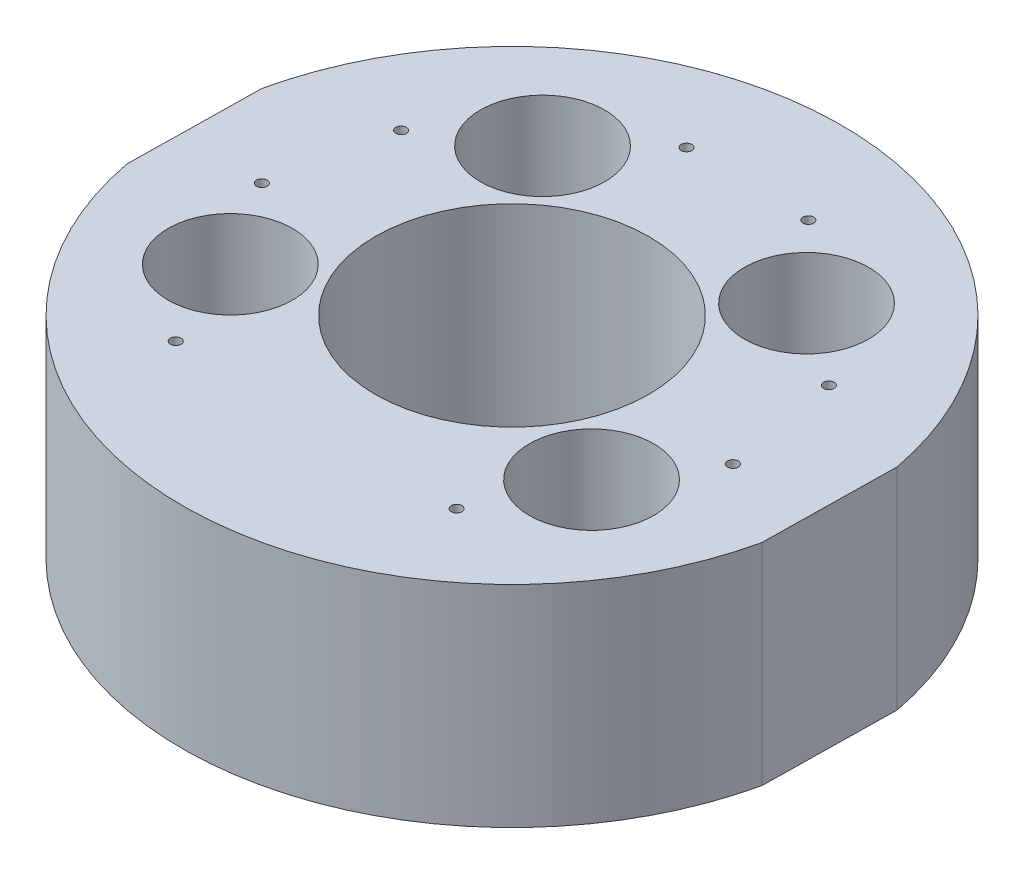
ISO-10303-21;
HEADER;
FILE_DESCRIPTION(('STEP AP214'),'2;1');
FILE_NAME('part.step','',(''),(''),'','','');
FILE_SCHEMA(('AUTOMOTIVE_DESIGN { 1 0 10303 214 1 1 1 1 }'));
ENDSEC;
DATA;
#1=APPLICATION_CONTEXT('core data for automotive mechanical design processes');
#2=APPLICATION_PROTOCOL_DEFINITION('international standard','automotive_design',2000,#1);
#3=PRODUCT_CONTEXT('',#1,'mechanical');
#4=PRODUCT('Part','Part','',(#3));
#5=PRODUCT_RELATED_PRODUCT_CATEGORY('part','',(#4));
#6=PRODUCT_DEFINITION_FORMATION('','',#4);
#7=PRODUCT_DEFINITION_CONTEXT('part definition',#1,'design');
#8=PRODUCT_DEFINITION('design','',#6,#7);
#9=PRODUCT_DEFINITION_SHAPE('','',#8);
#10=(LENGTH_UNIT() NAMED_UNIT(*) SI_UNIT(.MILLI.,.METRE.));
#11=(NAMED_UNIT(*) PLANE_ANGLE_UNIT() SI_UNIT($,.RADIAN.));
#12=(NAMED_UNIT(*) SI_UNIT($,.STERADIAN.) SOLID_ANGLE_UNIT());
#13=UNCERTAINTY_MEASURE_WITH_UNIT(LENGTH_MEASURE(1.E-05),#10,'distance_accuracy_value','');
#14=(GEOMETRIC_REPRESENTATION_CONTEXT(3) GLOBAL_UNCERTAINTY_ASSIGNED_CONTEXT((#13)) GLOBAL_UNIT_ASSIGNED_CONTEXT((#10,
#11,#12)) REPRESENTATION_CONTEXT('',''));
#15=CARTESIAN_POINT('',(0.,0.,0.));
#16=DIRECTION('',(0.,0.,1.));
#17=DIRECTION('',(1.,0.,0.));
#18=AXIS2_PLACEMENT_3D('',#15,#16,#17);
#19=CARTESIAN_POINT('',(-1.02943253800123,39.5,1.15205181792758));
#20=DIRECTION('',(0.,1.,0.));
#21=DIRECTION('',(0.,0.,1.));
#22=AXIS2_PLACEMENT_3D('',#19,#20,#21);
#23=PLANE('',#22);
#24=CARTESIAN_POINT('',(-41.5047424392578,39.5,-18.5138905291484));
#25=DIRECTION('',(0.,1.,0.));
#26=DIRECTION('',(0.,0.,1.));
#27=AXIS2_PLACEMENT_3D('',#24,#25,#26);
#28=CIRCLE('',#27,0.999999999999998);
#29=CARTESIAN_POINT('',(-41.5047424392578,39.5,-17.5138905291484));
#30=VERTEX_POINT('',#29);
#31=EDGE_CURVE('E41',#30,#30,#28,.T.);
#32=ORIENTED_EDGE('',*,*,#31,.F.);
#33=EDGE_LOOP('',(#32));
#34=FACE_BOUND('',#33,.T.);
#35=CARTESIAN_POINT('',(-45.985781079176,39.5,3.13364860960269));
#36=DIRECTION('',(0.,1.,0.));
#37=DIRECTION('',(0.,0.,1.));
#38=AXIS2_PLACEMENT_3D('',#35,#36,#37);
#39=CIRCLE('',#38,0.999999999999999);
#40=CARTESIAN_POINT('',(-45.985781079176,39.5,4.13364860960269));
#41=VERTEX_POINT('',#40);
#42=EDGE_CURVE('E137',#41,#41,#39,.T.);
#43=ORIENTED_EDGE('',*,*,#42,.F.);
#44=EDGE_LOOP('',(#43));
#45=FACE_BOUND('',#44,.T.);
#46=CARTESIAN_POINT('',(-28.3813979746461,39.5,36.8853694186284));
#47=DIRECTION('',(0.,1.,0.));
#48=DIRECTION('',(0.,0.,1.));
#49=AXIS2_PLACEMENT_3D('',#46,#47,#48);
#50=CIRCLE('',#49,1.);
#51=CARTESIAN_POINT('',(-28.3813979746461,39.5,37.8853694186284));
#52=VERTEX_POINT('',#51);
#53=EDGE_CURVE('E134',#52,#52,#50,.T.);
#54=ORIENTED_EDGE('',*,*,#53,.F.);
#55=EDGE_LOOP('',(#54));
#56=FACE_BOUND('',#55,.T.);
#57=CARTESIAN_POINT('',(25.1688006416338,39.5,37.7396532460756));
#58=DIRECTION('',(0.,1.,0.));
#59=DIRECTION('',(0.,0.,1.));
#60=AXIS2_PLACEMENT_3D('',#57,#58,#59);
#61=CIRCLE('',#60,1.);
#62=CARTESIAN_POINT('',(25.1688006416338,39.5,38.7396532460756));
#63=VERTEX_POINT('',#62);
#64=EDGE_CURVE('E130',#63,#63,#61,.T.);
#65=ORIENTED_EDGE('',*,*,#64,.F.);
#66=EDGE_LOOP('',(#65));
#67=FACE_BOUND('',#66,.T.);
#68=CARTESIAN_POINT('',(43.8408307817754,39.5,4.56664837001532));
#69=DIRECTION('',(0.,1.,0.));
#70=DIRECTION('',(0.,0.,1.));
#71=AXIS2_PLACEMENT_3D('',#68,#69,#70);
#72=CIRCLE('',#71,0.999999999999999);
#73=CARTESIAN_POINT('',(43.8408307817754,39.5,5.56664837001532));
#74=VERTEX_POINT('',#73);
#75=EDGE_CURVE('E126',#74,#74,#72,.T.);
#76=ORIENTED_EDGE('',*,*,#75,.F.);
#77=EDGE_LOOP('',(#76));
#78=FACE_BOUND('',#77,.T.);
#79=CARTESIAN_POINT('',(40.0525810184068,39.5,-17.2128103419404));
#80=DIRECTION('',(0.,1.,0.));
#81=DIRECTION('',(0.,0.,1.));
#82=AXIS2_PLACEMENT_3D('',#79,#80,#81);
#83=CIRCLE('',#82,1.);
#84=CARTESIAN_POINT('',(40.0525810184068,39.5,-16.2128103419404));
#85=VERTEX_POINT('',#84);
#86=EDGE_CURVE('E122',#85,#85,#83,.T.);
#87=ORIENTED_EDGE('',*,*,#86,.F.);
#88=EDGE_LOOP('',(#87));
#89=FACE_BOUND('',#88,.T.);
#90=CARTESIAN_POINT('',(11.2760466756778,39.5,-42.1327628556033));
#91=DIRECTION('',(0.,1.,0.));
#92=DIRECTION('',(0.,0.,1.));
#93=AXIS2_PLACEMENT_3D('',#90,#91,#92);
#94=CIRCLE('',#93,1.);
#95=CARTESIAN_POINT('',(11.2760466756778,39.5,-41.1327628556033));
#96=VERTEX_POINT('',#95);
#97=EDGE_CURVE('E118',#96,#96,#94,.T.);
#98=ORIENTED_EDGE('',*,*,#97,.F.);
#99=EDGE_LOOP('',(#98));
#100=FACE_BOUND('',#99,.T.);
#101=CARTESIAN_POINT('',(-11.9479600481531,39.5,-42.5032543545264));
#102=DIRECTION('',(0.,1.,0.));
#103=DIRECTION('',(0.,0.,1.));
#104=AXIS2_PLACEMENT_3D('',#101,#102,#103);
#105=CIRCLE('',#104,1.);
#106=CARTESIAN_POINT('',(-11.9479600481531,39.5,-41.5032543545264));
#107=VERTEX_POINT('',#106);
#108=EDGE_CURVE('E113',#107,#107,#105,.T.);
#109=ORIENTED_EDGE('',*,*,#108,.F.);
#110=EDGE_LOOP('',(#109));
#111=FACE_BOUND('',#110,.T.);
#112=CARTESIAN_POINT('',(33.1065521303134,39.5,20.3661126777402));
#113=DIRECTION('',(0.,1.,0.));
#114=DIRECTION('',(0.,0.,1.));
#115=AXIS2_PLACEMENT_3D('',#112,#113,#114);
#116=CIRCLE('',#115,11.666);
#117=CARTESIAN_POINT('',(33.1065521303134,39.5,32.0321126777402));
#118=VERTEX_POINT('',#117);
#119=EDGE_CURVE('E168',#118,#118,#116,.T.);
#120=ORIENTED_EDGE('',*,*,#119,.F.);
#121=EDGE_LOOP('',(#120));
#122=FACE_BOUND('',#121,.T.);
#123=CARTESIAN_POINT('',(-25.7151840641316,39.5,-29.2627349738644));
#124=DIRECTION('',(0.,1.,0.));
#125=DIRECTION('',(0.,0.,1.));
#126=AXIS2_PLACEMENT_3D('',#123,#124,#125);
#127=CIRCLE('',#126,11.666);
#128=CARTESIAN_POINT('',(-25.7151840641316,39.5,-17.5967349738644));
#129=VERTEX_POINT('',#128);
#130=EDGE_CURVE('E180',#129,#129,#127,.T.);
#131=ORIENTED_EDGE('',*,*,#130,.F.);
#132=EDGE_LOOP('',(#131));
#133=FACE_BOUND('',#132,.T.);
#134=CARTESIAN_POINT('',(-1.02943253800123,39.5,1.15205181792758));
#135=DIRECTION('',(0.,1.,0.));
#136=DIRECTION('',(0.,0.,1.));
#137=AXIS2_PLACEMENT_3D('',#134,#135,#136);
#138=CIRCLE('',#137,61.8170061942189);
#139=CARTESIAN_POINT('',(59.7022572722056,39.5,-10.3806888629692));
#140=VERTEX_POINT('',#139);
#141=CARTESIAN_POINT('',(-61.3623492511472,39.5,-12.3120268991914));
#142=VERTEX_POINT('',#141);
#143=EDGE_CURVE('E91',#140,#142,#138,.T.);
#144=ORIENTED_EDGE('',*,*,#143,.T.);
#145=DIRECTION('',(-0.0159509238824959,0.,0.999872775920664));
#146=VECTOR('',#145,1.);
#147=CARTESIAN_POINT('',(-61.3623492511472,39.5,-12.3120268991914));
#148=LINE('',#147,#146);
#149=CARTESIAN_POINT('',(-61.7611223482096,39.5,12.6847924988252));
#150=VERTEX_POINT('',#149);
#151=EDGE_CURVE('E86',#142,#150,#148,.T.);
#152=ORIENTED_EDGE('',*,*,#151,.T.);
#153=CARTESIAN_POINT('',(-1.02943253800123,39.5,1.15205181792758));
#154=DIRECTION('',(0.,1.,0.));
#155=DIRECTION('',(0.,0.,1.));
#156=AXIS2_PLACEMENT_3D('',#153,#154,#155);
#157=CIRCLE('',#156,61.817006194219);
#158=CARTESIAN_POINT('',(59.303484175144,39.5,14.6161305350469));
#159=VERTEX_POINT('',#158);
#160=EDGE_CURVE('E89',#150,#159,#157,.T.);
#161=ORIENTED_EDGE('',*,*,#160,.T.);
#162=DIRECTION('',(0.0159509238824956,0.,-0.999872775920664));
#163=VECTOR('',#162,1.);
#164=CARTESIAN_POINT('',(59.7022572722056,39.5,-10.3806888629692));
#165=LINE('',#164,#163);
#166=EDGE_CURVE('E56',#159,#140,#165,.T.);
#167=ORIENTED_EDGE('',*,*,#166,.T.);
#168=EDGE_LOOP('',(#144,#152,#161,#167));
#169=FACE_BOUND('',#168,.T.);
#170=CARTESIAN_POINT('',(-1.02943253800123,39.5,1.15205181792758));
#171=DIRECTION('',(0.,1.,0.));
#172=DIRECTION('',(0.,0.,1.));
#173=AXIS2_PLACEMENT_3D('',#170,#171,#172);
#174=CIRCLE('',#173,25.6670000000009);
#175=CARTESIAN_POINT('',(-1.02943253800123,39.5,26.8190518179285));
#176=VERTEX_POINT('',#175);
#177=EDGE_CURVE('E107',#176,#176,#174,.T.);
#178=ORIENTED_EDGE('',*,*,#177,.F.);
#179=EDGE_LOOP('',(#178));
#180=FACE_BOUND('',#179,.T.);
#181=CARTESIAN_POINT('',(24.6139217532643,39.5,-28.4598370899525));
#182=DIRECTION('',(0.,1.,0.));
#183=DIRECTION('',(0.,0.,1.));
#184=AXIS2_PLACEMENT_3D('',#181,#182,#183);
#185=CIRCLE('',#184,11.666);
#186=CARTESIAN_POINT('',(24.6139217532643,39.5,-16.7938370899525));
#187=VERTEX_POINT('',#186);
#188=EDGE_CURVE('E174',#187,#187,#185,.T.);
#189=ORIENTED_EDGE('',*,*,#188,.F.);
#190=EDGE_LOOP('',(#189));
#191=FACE_BOUND('',#190,.T.);
#192=CARTESIAN_POINT('',(-35.7609326951884,39.5,19.2674728958744));
#193=DIRECTION('',(0.,1.,0.));
#194=DIRECTION('',(0.,0.,1.));
#195=AXIS2_PLACEMENT_3D('',#192,#193,#194);
#196=CIRCLE('',#195,11.666);
#197=CARTESIAN_POINT('',(-35.7609326951884,39.5,30.9334728958744));
#198=VERTEX_POINT('',#197);
#199=EDGE_CURVE('E162',#198,#198,#196,.T.);
#200=ORIENTED_EDGE('',*,*,#199,.F.);
#201=EDGE_LOOP('',(#200));
#202=FACE_BOUND('',#201,.T.);
#203=ADVANCED_FACE('F37',(#34,#45,#56,#67,#78,#89,#100,#111,#122,#133,#169,#180,#191,#202),#23,.T.);
#204=CARTESIAN_POINT('',(-1.02943253800123,0.,1.15205181792758));
#205=DIRECTION('',(0.,1.,0.));
#206=DIRECTION('',(0.,0.,1.));
#207=AXIS2_PLACEMENT_3D('',#204,#205,#206);
#208=PLANE('',#207);
#209=CARTESIAN_POINT('',(33.1065521303134,0.,20.3661126777402));
#210=DIRECTION('',(0.,1.,0.));
#211=DIRECTION('',(0.,0.,1.));
#212=AXIS2_PLACEMENT_3D('',#209,#210,#211);
#213=CIRCLE('',#212,11.666);
#214=CARTESIAN_POINT('',(33.1065521303134,0.,32.0321126777402));
#215=VERTEX_POINT('',#214);
#216=EDGE_CURVE('E165',#215,#215,#213,.T.);
#217=ORIENTED_EDGE('',*,*,#216,.T.);
#218=EDGE_LOOP('',(#217));
#219=FACE_BOUND('',#218,.T.);
#220=CARTESIAN_POINT('',(-25.7151840641316,0.,-29.2627349738644));
#221=DIRECTION('',(0.,1.,0.));
#222=DIRECTION('',(0.,0.,1.));
#223=AXIS2_PLACEMENT_3D('',#220,#221,#222);
#224=CIRCLE('',#223,11.666);
#225=CARTESIAN_POINT('',(-25.7151840641316,0.,-17.5967349738644));
#226=VERTEX_POINT('',#225);
#227=EDGE_CURVE('E177',#226,#226,#224,.T.);
#228=ORIENTED_EDGE('',*,*,#227,.T.);
#229=EDGE_LOOP('',(#228));
#230=FACE_BOUND('',#229,.T.);
#231=CARTESIAN_POINT('',(-1.02943253800123,0.,1.15205181792758));
#232=DIRECTION('',(0.,1.,0.));
#233=DIRECTION('',(0.,0.,1.));
#234=AXIS2_PLACEMENT_3D('',#231,#232,#233);
#235=CIRCLE('',#234,61.8170061942189);
#236=CARTESIAN_POINT('',(59.7022572722056,0.,-10.3806888629692));
#237=VERTEX_POINT('',#236);
#238=CARTESIAN_POINT('',(-61.3623492511472,0.,-12.3120268991914));
#239=VERTEX_POINT('',#238);
#240=EDGE_CURVE('E104',#237,#239,#235,.T.);
#241=ORIENTED_EDGE('',*,*,#240,.F.);
#242=DIRECTION('',(0.0159509238824956,0.,-0.999872775920664));
#243=VECTOR('',#242,1.);
#244=CARTESIAN_POINT('',(59.7022572722056,0.,-10.3806888629692));
#245=LINE('',#244,#243);
#246=CARTESIAN_POINT('',(59.303484175144,0.,14.6161305350469));
#247=VERTEX_POINT('',#246);
#248=EDGE_CURVE('E79',#247,#237,#245,.T.);
#249=ORIENTED_EDGE('',*,*,#248,.F.);
#250=CARTESIAN_POINT('',(-1.02943253800123,0.,1.15205181792758));
#251=DIRECTION('',(0.,1.,0.));
#252=DIRECTION('',(0.,0.,1.));
#253=AXIS2_PLACEMENT_3D('',#250,#251,#252);
#254=CIRCLE('',#253,61.817006194219);
#255=CARTESIAN_POINT('',(-61.7611223482096,0.,12.6847924988252));
#256=VERTEX_POINT('',#255);
#257=EDGE_CURVE('E73',#256,#247,#254,.T.);
#258=ORIENTED_EDGE('',*,*,#257,.F.);
#259=DIRECTION('',(-0.0159509238824959,0.,0.999872775920664));
#260=VECTOR('',#259,1.);
#261=CARTESIAN_POINT('',(-61.3623492511472,0.,-12.3120268991914));
#262=LINE('',#261,#260);
#263=EDGE_CURVE('E95',#239,#256,#262,.T.);
#264=ORIENTED_EDGE('',*,*,#263,.F.);
#265=EDGE_LOOP('',(#241,#249,#258,#264));
#266=FACE_BOUND('',#265,.T.);
#267=CARTESIAN_POINT('',(-1.02943253800123,0.,1.15205181792758));
#268=DIRECTION('',(0.,1.,0.));
#269=DIRECTION('',(0.,0.,1.));
#270=AXIS2_PLACEMENT_3D('',#267,#268,#269);
#271=CIRCLE('',#270,25.6670000000009);
#272=CARTESIAN_POINT('',(-1.02943253800123,0.,26.8190518179285));
#273=VERTEX_POINT('',#272);
#274=EDGE_CURVE('E183',#273,#273,#271,.T.);
#275=ORIENTED_EDGE('',*,*,#274,.T.);
#276=EDGE_LOOP('',(#275));
#277=FACE_BOUND('',#276,.T.);
#278=CARTESIAN_POINT('',(24.6139217532643,0.,-28.4598370899525));
#279=DIRECTION('',(0.,1.,0.));
#280=DIRECTION('',(0.,0.,1.));
#281=AXIS2_PLACEMENT_3D('',#278,#279,#280);
#282=CIRCLE('',#281,11.666);
#283=CARTESIAN_POINT('',(24.6139217532643,0.,-16.7938370899525));
#284=VERTEX_POINT('',#283);
#285=EDGE_CURVE('E171',#284,#284,#282,.T.);
#286=ORIENTED_EDGE('',*,*,#285,.T.);
#287=EDGE_LOOP('',(#286));
#288=FACE_BOUND('',#287,.T.);
#289=CARTESIAN_POINT('',(-35.7609326951884,0.,19.2674728958744));
#290=DIRECTION('',(0.,1.,0.));
#291=DIRECTION('',(0.,0.,1.));
#292=AXIS2_PLACEMENT_3D('',#289,#290,#291);
#293=CIRCLE('',#292,11.666);
#294=CARTESIAN_POINT('',(-35.7609326951884,0.,30.9334728958744));
#295=VERTEX_POINT('',#294);
#296=EDGE_CURVE('E116',#295,#295,#293,.T.);
#297=ORIENTED_EDGE('',*,*,#296,.T.);
#298=EDGE_LOOP('',(#297));
#299=FACE_BOUND('',#298,.T.);
#300=ADVANCED_FACE('F191',(#219,#230,#266,#277,#288,#299),#208,.F.);
#301=CARTESIAN_POINT('',(-1.02943253800123,39.5,1.15205181792758));
#302=DIRECTION('',(0.,-1.,0.));
#303=DIRECTION('',(0.,0.,-1.));
#304=AXIS2_PLACEMENT_3D('',#301,#302,#303);
#305=CYLINDRICAL_SURFACE('',#304,61.8170061942189);
#306=ORIENTED_EDGE('',*,*,#240,.T.);
#307=DIRECTION('',(0.,-1.,0.));
#308=VECTOR('',#307,1.);
#309=CARTESIAN_POINT('',(-61.3623492511472,39.5,-12.3120268991914));
#310=LINE('',#309,#308);
#311=EDGE_CURVE('E11',#142,#239,#310,.T.);
#312=ORIENTED_EDGE('',*,*,#311,.F.);
#313=ORIENTED_EDGE('',*,*,#143,.F.);
#314=DIRECTION('',(0.,-1.,0.));
#315=VECTOR('',#314,1.);
#316=CARTESIAN_POINT('',(59.7022572722056,39.5,-10.3806888629692));
#317=LINE('',#316,#315);
#318=EDGE_CURVE('E100',#140,#237,#317,.T.);
#319=ORIENTED_EDGE('',*,*,#318,.T.);
#320=EDGE_LOOP('',(#306,#312,#313,#319));
#321=FACE_BOUND('',#320,.T.);
#322=ADVANCED_FACE('F39',(#321),#305,.T.);
#323=CARTESIAN_POINT('',(-61.3623492511472,39.5,-12.3120268991914));
#324=DIRECTION('',(0.999872775920664,0.,0.0159509238824959));
#325=DIRECTION('',(0.0159509238824959,0.,-0.999872775920664));
#326=AXIS2_PLACEMENT_3D('',#323,#324,#325);
#327=PLANE('',#326);
#328=ORIENTED_EDGE('',*,*,#263,.T.);
#329=DIRECTION('',(0.,-1.,0.));
#330=VECTOR('',#329,1.);
#331=CARTESIAN_POINT('',(-61.7611223482096,39.5,12.6847924988252));
#332=LINE('',#331,#330);
#333=EDGE_CURVE('E47',#150,#256,#332,.T.);
#334=ORIENTED_EDGE('',*,*,#333,.F.);
#335=ORIENTED_EDGE('',*,*,#151,.F.);
#336=ORIENTED_EDGE('',*,*,#311,.T.);
#337=EDGE_LOOP('',(#328,#334,#335,#336));
#338=FACE_BOUND('',#337,.T.);
#339=ADVANCED_FACE('F94',(#338),#327,.F.);
#340=CARTESIAN_POINT('',(-1.02943253800123,39.5,1.15205181792758));
#341=DIRECTION('',(0.,-1.,0.));
#342=DIRECTION('',(0.,0.,-1.));
#343=AXIS2_PLACEMENT_3D('',#340,#341,#342);
#344=CYLINDRICAL_SURFACE('',#343,61.817006194219);
#345=ORIENTED_EDGE('',*,*,#257,.T.);
#346=DIRECTION('',(0.,-1.,0.));
#347=VECTOR('',#346,1.);
#348=CARTESIAN_POINT('',(59.303484175144,39.5,14.6161305350469));
#349=LINE('',#348,#347);
#350=EDGE_CURVE('E96',#159,#247,#349,.T.);
#351=ORIENTED_EDGE('',*,*,#350,.F.);
#352=ORIENTED_EDGE('',*,*,#160,.F.);
#353=ORIENTED_EDGE('',*,*,#333,.T.);
#354=EDGE_LOOP('',(#345,#351,#352,#353));
#355=FACE_BOUND('',#354,.T.);
#356=ADVANCED_FACE('F98',(#355),#344,.T.);
#357=CARTESIAN_POINT('',(59.7022572722056,39.5,-10.3806888629692));
#358=DIRECTION('',(-0.999872775920664,0.,-0.0159509238824956));
#359=DIRECTION('',(-0.0159509238824956,0.,0.999872775920664));
#360=AXIS2_PLACEMENT_3D('',#357,#358,#359);
#361=PLANE('',#360);
#362=ORIENTED_EDGE('',*,*,#248,.T.);
#363=ORIENTED_EDGE('',*,*,#318,.F.);
#364=ORIENTED_EDGE('',*,*,#166,.F.);
#365=ORIENTED_EDGE('',*,*,#350,.T.);
#366=EDGE_LOOP('',(#362,#363,#364,#365));
#367=FACE_BOUND('',#366,.T.);
#368=ADVANCED_FACE('F197',(#367),#361,.F.);
#369=CARTESIAN_POINT('',(-1.02943253800123,39.5,1.15205181792758));
#370=DIRECTION('',(0.,-1.,0.));
#371=DIRECTION('',(0.,0.,-1.));
#372=AXIS2_PLACEMENT_3D('',#369,#370,#371);
#373=CYLINDRICAL_SURFACE('',#372,25.6670000000009);
#374=ORIENTED_EDGE('',*,*,#177,.T.);
#375=EDGE_LOOP('',(#374));
#376=FACE_BOUND('',#375,.T.);
#377=ORIENTED_EDGE('',*,*,#274,.F.);
#378=EDGE_LOOP('',(#377));
#379=FACE_BOUND('',#378,.T.);
#380=ADVANCED_FACE('F194',(#376,#379),#373,.F.);
#381=CARTESIAN_POINT('',(-25.7151840641316,39.5,-29.2627349738644));
#382=DIRECTION('',(0.,-1.,0.));
#383=DIRECTION('',(0.,0.,-1.));
#384=AXIS2_PLACEMENT_3D('',#381,#382,#383);
#385=CYLINDRICAL_SURFACE('',#384,11.666);
#386=ORIENTED_EDGE('',*,*,#130,.T.);
#387=EDGE_LOOP('',(#386));
#388=FACE_BOUND('',#387,.T.);
#389=ORIENTED_EDGE('',*,*,#227,.F.);
#390=EDGE_LOOP('',(#389));
#391=FACE_BOUND('',#390,.T.);
#392=ADVANCED_FACE('F196',(#388,#391),#385,.F.);
#393=CARTESIAN_POINT('',(24.6139217532643,39.5,-28.4598370899525));
#394=DIRECTION('',(0.,-1.,0.));
#395=DIRECTION('',(0.,0.,-1.));
#396=AXIS2_PLACEMENT_3D('',#393,#394,#395);
#397=CYLINDRICAL_SURFACE('',#396,11.666);
#398=ORIENTED_EDGE('',*,*,#188,.T.);
#399=EDGE_LOOP('',(#398));
#400=FACE_BOUND('',#399,.T.);
#401=ORIENTED_EDGE('',*,*,#285,.F.);
#402=EDGE_LOOP('',(#401));
#403=FACE_BOUND('',#402,.T.);
#404=ADVANCED_FACE('F204',(#400,#403),#397,.F.);
#405=CARTESIAN_POINT('',(33.1065521303134,39.5,20.3661126777402));
#406=DIRECTION('',(0.,-1.,0.));
#407=DIRECTION('',(0.,0.,-1.));
#408=AXIS2_PLACEMENT_3D('',#405,#406,#407);
#409=CYLINDRICAL_SURFACE('',#408,11.666);
#410=ORIENTED_EDGE('',*,*,#119,.T.);
#411=EDGE_LOOP('',(#410));
#412=FACE_BOUND('',#411,.T.);
#413=ORIENTED_EDGE('',*,*,#216,.F.);
#414=EDGE_LOOP('',(#413));
#415=FACE_BOUND('',#414,.T.);
#416=ADVANCED_FACE('F274',(#412,#415),#409,.F.);
#417=CARTESIAN_POINT('',(-35.7609326951884,39.5,19.2674728958744));
#418=DIRECTION('',(0.,-1.,0.));
#419=DIRECTION('',(0.,0.,-1.));
#420=AXIS2_PLACEMENT_3D('',#417,#418,#419);
#421=CYLINDRICAL_SURFACE('',#420,11.666);
#422=ORIENTED_EDGE('',*,*,#199,.T.);
#423=EDGE_LOOP('',(#422));
#424=FACE_BOUND('',#423,.T.);
#425=ORIENTED_EDGE('',*,*,#296,.F.);
#426=EDGE_LOOP('',(#425));
#427=FACE_BOUND('',#426,.T.);
#428=ADVANCED_FACE('F283',(#424,#427),#421,.F.);
#429=CARTESIAN_POINT('',(-11.9479600481531,28.5,-42.5032543545264));
#430=DIRECTION('',(0.,1.,0.));
#431=DIRECTION('',(-1.,0.,0.));
#432=AXIS2_PLACEMENT_3D('',#429,#430,#431);
#433=CYLINDRICAL_SURFACE('',#432,1.);
#434=ORIENTED_EDGE('',*,*,#108,.T.);
#435=EDGE_LOOP('',(#434));
#436=FACE_BOUND('',#435,.T.);
#437=CARTESIAN_POINT('',(-11.9479600481531,28.5,-42.5032543545264));
#438=DIRECTION('',(0.,1.,0.));
#439=DIRECTION('',(-1.,0.,0.));
#440=AXIS2_PLACEMENT_3D('',#437,#438,#439);
#441=CIRCLE('',#440,1.);
#442=CARTESIAN_POINT('',(-12.9479600481531,28.5,-42.5032543545264));
#443=VERTEX_POINT('',#442);
#444=EDGE_CURVE('E117',#443,#443,#441,.T.);
#445=ORIENTED_EDGE('',*,*,#444,.F.);
#446=EDGE_LOOP('',(#445));
#447=FACE_BOUND('',#446,.T.);
#448=ADVANCED_FACE('F291',(#436,#447),#433,.F.);
#449=CARTESIAN_POINT('',(-11.9479600481531,28.5,-42.5032543545264));
#450=DIRECTION('',(0.,1.,0.));
#451=DIRECTION('',(-1.,0.,0.));
#452=AXIS2_PLACEMENT_3D('',#449,#450,#451);
#453=PLANE('',#452);
#454=ORIENTED_EDGE('',*,*,#444,.T.);
#455=EDGE_LOOP('',(#454));
#456=FACE_BOUND('',#455,.T.);
#457=ADVANCED_FACE('F299',(#456),#453,.T.);
#458=CARTESIAN_POINT('',(11.2760466756778,28.5,-42.1327628556033));
#459=DIRECTION('',(0.,1.,0.));
#460=DIRECTION('',(-1.,0.,0.));
#461=AXIS2_PLACEMENT_3D('',#458,#459,#460);
#462=CYLINDRICAL_SURFACE('',#461,1.);
#463=ORIENTED_EDGE('',*,*,#97,.T.);
#464=EDGE_LOOP('',(#463));
#465=FACE_BOUND('',#464,.T.);
#466=CARTESIAN_POINT('',(11.2760466756778,28.5,-42.1327628556033));
#467=DIRECTION('',(0.,1.,0.));
#468=DIRECTION('',(-1.,0.,0.));
#469=AXIS2_PLACEMENT_3D('',#466,#467,#468);
#470=CIRCLE('',#469,1.);
#471=CARTESIAN_POINT('',(10.2760466756778,28.5,-42.1327628556033));
#472=VERTEX_POINT('',#471);
#473=EDGE_CURVE('E121',#472,#472,#470,.T.);
#474=ORIENTED_EDGE('',*,*,#473,.F.);
#475=EDGE_LOOP('',(#474));
#476=FACE_BOUND('',#475,.T.);
#477=ADVANCED_FACE('F308',(#465,#476),#462,.F.);
#478=CARTESIAN_POINT('',(11.2760466756778,28.5,-42.1327628556033));
#479=DIRECTION('',(0.,1.,0.));
#480=DIRECTION('',(-1.,0.,0.));
#481=AXIS2_PLACEMENT_3D('',#478,#479,#480);
#482=PLANE('',#481);
#483=ORIENTED_EDGE('',*,*,#473,.T.);
#484=EDGE_LOOP('',(#483));
#485=FACE_BOUND('',#484,.T.);
#486=ADVANCED_FACE('F317',(#485),#482,.T.);
#487=CARTESIAN_POINT('',(40.0525810184068,28.5,-17.2128103419404));
#488=DIRECTION('',(0.,1.,0.));
#489=DIRECTION('',(-1.,0.,0.));
#490=AXIS2_PLACEMENT_3D('',#487,#488,#489);
#491=CYLINDRICAL_SURFACE('',#490,1.);
#492=ORIENTED_EDGE('',*,*,#86,.T.);
#493=EDGE_LOOP('',(#492));
#494=FACE_BOUND('',#493,.T.);
#495=CARTESIAN_POINT('',(40.0525810184068,28.5,-17.2128103419404));
#496=DIRECTION('',(0.,1.,0.));
#497=DIRECTION('',(-1.,0.,0.));
#498=AXIS2_PLACEMENT_3D('',#495,#496,#497);
#499=CIRCLE('',#498,1.);
#500=CARTESIAN_POINT('',(39.0525810184068,28.5,-17.2128103419404));
#501=VERTEX_POINT('',#500);
#502=EDGE_CURVE('E125',#501,#501,#499,.T.);
#503=ORIENTED_EDGE('',*,*,#502,.F.);
#504=EDGE_LOOP('',(#503));
#505=FACE_BOUND('',#504,.T.);
#506=ADVANCED_FACE('F326',(#494,#505),#491,.F.);
#507=CARTESIAN_POINT('',(40.0525810184068,28.5,-17.2128103419404));
#508=DIRECTION('',(0.,1.,0.));
#509=DIRECTION('',(-1.,0.,0.));
#510=AXIS2_PLACEMENT_3D('',#507,#508,#509);
#511=PLANE('',#510);
#512=ORIENTED_EDGE('',*,*,#502,.T.);
#513=EDGE_LOOP('',(#512));
#514=FACE_BOUND('',#513,.T.);
#515=ADVANCED_FACE('F335',(#514),#511,.T.);
#516=CARTESIAN_POINT('',(43.8408307817754,28.5,4.56664837001532));
#517=DIRECTION('',(0.,1.,0.));
#518=DIRECTION('',(-1.,0.,0.));
#519=AXIS2_PLACEMENT_3D('',#516,#517,#518);
#520=CYLINDRICAL_SURFACE('',#519,0.999999999999999);
#521=ORIENTED_EDGE('',*,*,#75,.T.);
#522=EDGE_LOOP('',(#521));
#523=FACE_BOUND('',#522,.T.);
#524=CARTESIAN_POINT('',(43.8408307817754,28.5,4.56664837001532));
#525=DIRECTION('',(0.,1.,0.));
#526=DIRECTION('',(-1.,0.,0.));
#527=AXIS2_PLACEMENT_3D('',#524,#525,#526);
#528=CIRCLE('',#527,0.999999999999999);
#529=CARTESIAN_POINT('',(42.8408307817754,28.5,4.56664837001532));
#530=VERTEX_POINT('',#529);
#531=EDGE_CURVE('E129',#530,#530,#528,.T.);
#532=ORIENTED_EDGE('',*,*,#531,.F.);
#533=EDGE_LOOP('',(#532));
#534=FACE_BOUND('',#533,.T.);
#535=ADVANCED_FACE('F344',(#523,#534),#520,.F.);
#536=CARTESIAN_POINT('',(43.8408307817754,28.5,4.56664837001532));
#537=DIRECTION('',(0.,1.,0.));
#538=DIRECTION('',(-1.,0.,0.));
#539=AXIS2_PLACEMENT_3D('',#536,#537,#538);
#540=PLANE('',#539);
#541=ORIENTED_EDGE('',*,*,#531,.T.);
#542=EDGE_LOOP('',(#541));
#543=FACE_BOUND('',#542,.T.);
#544=ADVANCED_FACE('F353',(#543),#540,.T.);
#545=CARTESIAN_POINT('',(25.1688006416338,28.5,37.7396532460756));
#546=DIRECTION('',(0.,1.,0.));
#547=DIRECTION('',(-1.,0.,0.));
#548=AXIS2_PLACEMENT_3D('',#545,#546,#547);
#549=CYLINDRICAL_SURFACE('',#548,1.);
#550=ORIENTED_EDGE('',*,*,#64,.T.);
#551=EDGE_LOOP('',(#550));
#552=FACE_BOUND('',#551,.T.);
#553=CARTESIAN_POINT('',(25.1688006416338,28.5,37.7396532460756));
#554=DIRECTION('',(0.,1.,0.));
#555=DIRECTION('',(-1.,0.,0.));
#556=AXIS2_PLACEMENT_3D('',#553,#554,#555);
#557=CIRCLE('',#556,1.);
#558=CARTESIAN_POINT('',(24.1688006416338,28.5,37.7396532460756));
#559=VERTEX_POINT('',#558);
#560=EDGE_CURVE('E133',#559,#559,#557,.T.);
#561=ORIENTED_EDGE('',*,*,#560,.F.);
#562=EDGE_LOOP('',(#561));
#563=FACE_BOUND('',#562,.T.);
#564=ADVANCED_FACE('F362',(#552,#563),#549,.F.);
#565=CARTESIAN_POINT('',(25.1688006416338,28.5,37.7396532460756));
#566=DIRECTION('',(0.,1.,0.));
#567=DIRECTION('',(-1.,0.,0.));
#568=AXIS2_PLACEMENT_3D('',#565,#566,#567);
#569=PLANE('',#568);
#570=ORIENTED_EDGE('',*,*,#560,.T.);
#571=EDGE_LOOP('',(#570));
#572=FACE_BOUND('',#571,.T.);
#573=ADVANCED_FACE('F371',(#572),#569,.T.);
#574=CARTESIAN_POINT('',(-28.3813979746461,28.5,36.8853694186284));
#575=DIRECTION('',(0.,1.,0.));
#576=DIRECTION('',(-1.,0.,0.));
#577=AXIS2_PLACEMENT_3D('',#574,#575,#576);
#578=CYLINDRICAL_SURFACE('',#577,1.);
#579=ORIENTED_EDGE('',*,*,#53,.T.);
#580=EDGE_LOOP('',(#579));
#581=FACE_BOUND('',#580,.T.);
#582=CARTESIAN_POINT('',(-28.3813979746461,28.5,36.8853694186284));
#583=DIRECTION('',(0.,1.,0.));
#584=DIRECTION('',(-1.,0.,0.));
#585=AXIS2_PLACEMENT_3D('',#582,#583,#584);
#586=CIRCLE('',#585,1.);
#587=CARTESIAN_POINT('',(-29.3813979746461,28.5,36.8853694186284));
#588=VERTEX_POINT('',#587);
#589=EDGE_CURVE('E136',#588,#588,#586,.T.);
#590=ORIENTED_EDGE('',*,*,#589,.F.);
#591=EDGE_LOOP('',(#590));
#592=FACE_BOUND('',#591,.T.);
#593=ADVANCED_FACE('F380',(#581,#592),#578,.F.);
#594=CARTESIAN_POINT('',(-28.3813979746461,28.5,36.8853694186284));
#595=DIRECTION('',(0.,1.,0.));
#596=DIRECTION('',(-1.,0.,0.));
#597=AXIS2_PLACEMENT_3D('',#594,#595,#596);
#598=PLANE('',#597);
#599=ORIENTED_EDGE('',*,*,#589,.T.);
#600=EDGE_LOOP('',(#599));
#601=FACE_BOUND('',#600,.T.);
#602=ADVANCED_FACE('F389',(#601),#598,.T.);
#603=CARTESIAN_POINT('',(-45.985781079176,28.5,3.13364860960269));
#604=DIRECTION('',(0.,1.,0.));
#605=DIRECTION('',(-1.,0.,0.));
#606=AXIS2_PLACEMENT_3D('',#603,#604,#605);
#607=CYLINDRICAL_SURFACE('',#606,0.999999999999999);
#608=ORIENTED_EDGE('',*,*,#42,.T.);
#609=EDGE_LOOP('',(#608));
#610=FACE_BOUND('',#609,.T.);
#611=CARTESIAN_POINT('',(-45.985781079176,28.5,3.13364860960269));
#612=DIRECTION('',(0.,1.,0.));
#613=DIRECTION('',(-1.,0.,0.));
#614=AXIS2_PLACEMENT_3D('',#611,#612,#613);
#615=CIRCLE('',#614,0.999999999999999);
#616=CARTESIAN_POINT('',(-46.985781079176,28.5,3.13364860960269));
#617=VERTEX_POINT('',#616);
#618=EDGE_CURVE('E139',#617,#617,#615,.T.);
#619=ORIENTED_EDGE('',*,*,#618,.F.);
#620=EDGE_LOOP('',(#619));
#621=FACE_BOUND('',#620,.T.);
#622=ADVANCED_FACE('F398',(#610,#621),#607,.F.);
#623=CARTESIAN_POINT('',(-45.985781079176,28.5,3.13364860960269));
#624=DIRECTION('',(0.,1.,0.));
#625=DIRECTION('',(-1.,0.,0.));
#626=AXIS2_PLACEMENT_3D('',#623,#624,#625);
#627=PLANE('',#626);
#628=ORIENTED_EDGE('',*,*,#618,.T.);
#629=EDGE_LOOP('',(#628));
#630=FACE_BOUND('',#629,.T.);
#631=ADVANCED_FACE('F407',(#630),#627,.T.);
#632=CARTESIAN_POINT('',(-41.5047424392578,28.5,-18.5138905291484));
#633=DIRECTION('',(0.,1.,0.));
#634=DIRECTION('',(-1.,0.,0.));
#635=AXIS2_PLACEMENT_3D('',#632,#633,#634);
#636=CYLINDRICAL_SURFACE('',#635,0.999999999999998);
#637=ORIENTED_EDGE('',*,*,#31,.T.);
#638=EDGE_LOOP('',(#637));
#639=FACE_BOUND('',#638,.T.);
#640=CARTESIAN_POINT('',(-41.5047424392578,28.5,-18.5138905291484));
#641=DIRECTION('',(0.,1.,0.));
#642=DIRECTION('',(-1.,0.,0.));
#643=AXIS2_PLACEMENT_3D('',#640,#641,#642);
#644=CIRCLE('',#643,0.999999999999998);
#645=CARTESIAN_POINT('',(-42.5047424392578,28.5,-18.5138905291484));
#646=VERTEX_POINT('',#645);
#647=EDGE_CURVE('E149',#646,#646,#644,.T.);
#648=ORIENTED_EDGE('',*,*,#647,.F.);
#649=EDGE_LOOP('',(#648));
#650=FACE_BOUND('',#649,.T.);
#651=ADVANCED_FACE('F415',(#639,#650),#636,.F.);
#652=CARTESIAN_POINT('',(-41.5047424392578,28.5,-18.5138905291484));
#653=DIRECTION('',(0.,1.,0.));
#654=DIRECTION('',(-1.,0.,0.));
#655=AXIS2_PLACEMENT_3D('',#652,#653,#654);
#656=PLANE('',#655);
#657=ORIENTED_EDGE('',*,*,#647,.T.);
#658=EDGE_LOOP('',(#657));
#659=FACE_BOUND('',#658,.T.);
#660=ADVANCED_FACE('F423',(#659),#656,.T.);
#661=CLOSED_SHELL('',(#203,#300,#322,#339,#356,#368,#380,#392,#404,#416,#428,#448,#457,#477,
#486,#506,#515,#535,#544,#564,#573,#593,#602,#622,#631,#651,#660));
#662=MANIFOLD_SOLID_BREP('B2',#661);
#663=ADVANCED_BREP_SHAPE_REPRESENTATION('',(#18,#662),#14);
#664=SHAPE_DEFINITION_REPRESENTATION(#9,#663);
ENDSEC;
END-ISO-10303-21;
